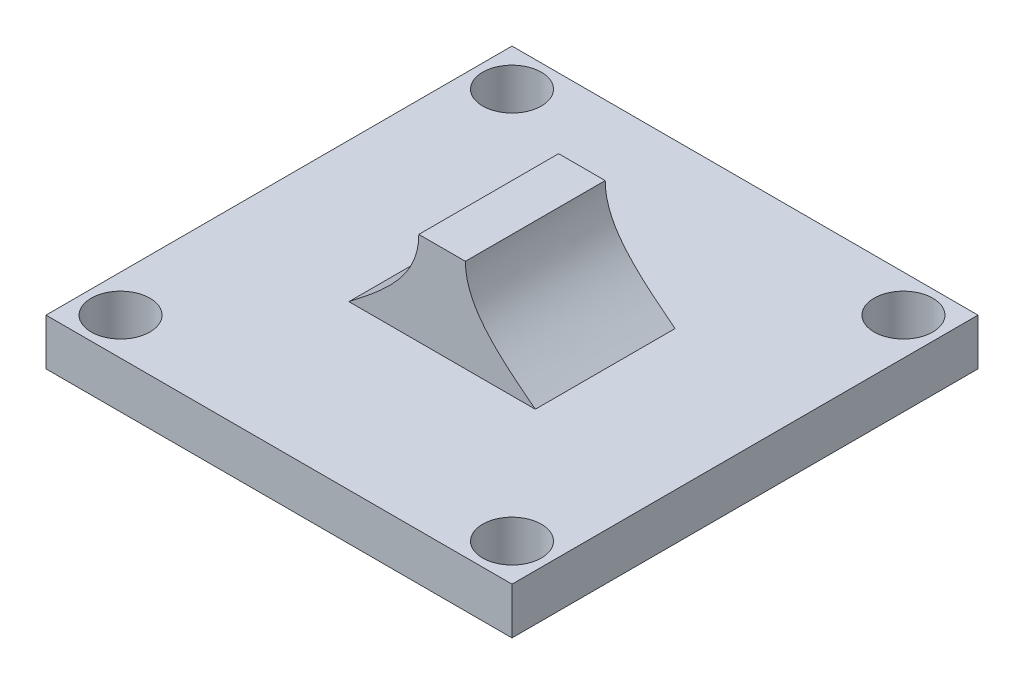
ISO-10303-21;
HEADER;
FILE_DESCRIPTION(('STEP AP214'),'2;1');
FILE_NAME('part.step','',(''),(''),'','','');
FILE_SCHEMA(('AUTOMOTIVE_DESIGN { 1 0 10303 214 1 1 1 1 }'));
ENDSEC;
DATA;
#1=APPLICATION_CONTEXT('core data for automotive mechanical design processes');
#2=APPLICATION_PROTOCOL_DEFINITION('international standard','automotive_design',2000,#1);
#3=PRODUCT_CONTEXT('',#1,'mechanical');
#4=PRODUCT('Part','Part','',(#3));
#5=PRODUCT_RELATED_PRODUCT_CATEGORY('part','',(#4));
#6=PRODUCT_DEFINITION_FORMATION('','',#4);
#7=PRODUCT_DEFINITION_CONTEXT('part definition',#1,'design');
#8=PRODUCT_DEFINITION('design','',#6,#7);
#9=PRODUCT_DEFINITION_SHAPE('','',#8);
#10=(LENGTH_UNIT() NAMED_UNIT(*) SI_UNIT(.MILLI.,.METRE.));
#11=(NAMED_UNIT(*) PLANE_ANGLE_UNIT() SI_UNIT($,.RADIAN.));
#12=(NAMED_UNIT(*) SI_UNIT($,.STERADIAN.) SOLID_ANGLE_UNIT());
#13=UNCERTAINTY_MEASURE_WITH_UNIT(LENGTH_MEASURE(1.E-05),#10,'distance_accuracy_value','');
#14=(GEOMETRIC_REPRESENTATION_CONTEXT(3) GLOBAL_UNCERTAINTY_ASSIGNED_CONTEXT((#13)) GLOBAL_UNIT_ASSIGNED_CONTEXT((#10,
#11,#12)) REPRESENTATION_CONTEXT('',''));
#15=CARTESIAN_POINT('',(0.,0.,0.));
#16=DIRECTION('',(0.,0.,1.));
#17=DIRECTION('',(1.,0.,0.));
#18=AXIS2_PLACEMENT_3D('',#15,#16,#17);
#19=CARTESIAN_POINT('',(0.,5.,0.));
#20=DIRECTION('',(0.,1.,0.));
#21=DIRECTION('',(0.,0.,1.));
#22=AXIS2_PLACEMENT_3D('',#19,#20,#21);
#23=PLANE('',#22);
#24=CARTESIAN_POINT('',(-21.,5.,-21.));
#25=DIRECTION('',(0.,1.,0.));
#26=DIRECTION('',(0.,0.,1.));
#27=AXIS2_PLACEMENT_3D('',#24,#25,#26);
#28=CIRCLE('',#27,3.15);
#29=CARTESIAN_POINT('',(-21.,5.,-24.15));
#30=VERTEX_POINT('',#29);
#31=EDGE_CURVE('E377',#30,#30,#28,.T.);
#32=ORIENTED_EDGE('',*,*,#31,.F.);
#33=EDGE_LOOP('',(#32));
#34=FACE_BOUND('',#33,.T.);
#35=CARTESIAN_POINT('',(21.,5.,-21.));
#36=DIRECTION('',(0.,1.,0.));
#37=DIRECTION('',(0.,0.,1.));
#38=AXIS2_PLACEMENT_3D('',#35,#36,#37);
#39=CIRCLE('',#38,3.15);
#40=CARTESIAN_POINT('',(21.,5.,-24.15));
#41=VERTEX_POINT('',#40);
#42=EDGE_CURVE('E380',#41,#41,#39,.T.);
#43=ORIENTED_EDGE('',*,*,#42,.F.);
#44=EDGE_LOOP('',(#43));
#45=FACE_BOUND('',#44,.T.);
#46=CARTESIAN_POINT('',(21.,5.,21.));
#47=DIRECTION('',(0.,1.,0.));
#48=DIRECTION('',(0.,0.,1.));
#49=AXIS2_PLACEMENT_3D('',#46,#47,#48);
#50=CIRCLE('',#49,3.15);
#51=CARTESIAN_POINT('',(21.,5.,17.85));
#52=VERTEX_POINT('',#51);
#53=EDGE_CURVE('E388',#52,#52,#50,.T.);
#54=ORIENTED_EDGE('',*,*,#53,.F.);
#55=EDGE_LOOP('',(#54));
#56=FACE_BOUND('',#55,.T.);
#57=CARTESIAN_POINT('',(-21.,5.,21.));
#58=DIRECTION('',(0.,1.,0.));
#59=DIRECTION('',(0.,0.,1.));
#60=AXIS2_PLACEMENT_3D('',#57,#58,#59);
#61=CIRCLE('',#60,3.15);
#62=CARTESIAN_POINT('',(-21.,5.,17.85));
#63=VERTEX_POINT('',#62);
#64=EDGE_CURVE('E510',#63,#63,#61,.T.);
#65=ORIENTED_EDGE('',*,*,#64,.F.);
#66=EDGE_LOOP('',(#65));
#67=FACE_BOUND('',#66,.T.);
#68=DIRECTION('',(0.,0.,-1.));
#69=VECTOR('',#68,1.);
#70=CARTESIAN_POINT('',(25.,5.,-25.));
#71=LINE('',#70,#69);
#72=CARTESIAN_POINT('',(25.,5.,25.));
#73=VERTEX_POINT('',#72);
#74=CARTESIAN_POINT('',(25.,5.,-25.));
#75=VERTEX_POINT('',#74);
#76=EDGE_CURVE('E270',#73,#75,#71,.T.);
#77=ORIENTED_EDGE('',*,*,#76,.T.);
#78=DIRECTION('',(-1.,0.,0.));
#79=VECTOR('',#78,1.);
#80=CARTESIAN_POINT('',(-25.,5.,-25.));
#81=LINE('',#80,#79);
#82=CARTESIAN_POINT('',(-25.,5.,-25.));
#83=VERTEX_POINT('',#82);
#84=EDGE_CURVE('E125',#75,#83,#81,.T.);
#85=ORIENTED_EDGE('',*,*,#84,.T.);
#86=DIRECTION('',(0.,0.,1.));
#87=VECTOR('',#86,1.);
#88=CARTESIAN_POINT('',(-25.,5.,-25.));
#89=LINE('',#88,#87);
#90=CARTESIAN_POINT('',(-25.,5.,25.));
#91=VERTEX_POINT('',#90);
#92=EDGE_CURVE('E263',#83,#91,#89,.T.);
#93=ORIENTED_EDGE('',*,*,#92,.T.);
#94=DIRECTION('',(1.,0.,0.));
#95=VECTOR('',#94,1.);
#96=CARTESIAN_POINT('',(-25.,5.,25.));
#97=LINE('',#96,#95);
#98=EDGE_CURVE('E97',#91,#73,#97,.T.);
#99=ORIENTED_EDGE('',*,*,#98,.T.);
#100=EDGE_LOOP('',(#77,#85,#93,#99));
#101=FACE_BOUND('',#100,.T.);
#102=DIRECTION('',(-1.,0.,0.));
#103=VECTOR('',#102,1.);
#104=CARTESIAN_POINT('',(-10.,5.,-7.5));
#105=LINE('',#104,#103);
#106=CARTESIAN_POINT('',(9.99999999999999,5.,-7.5));
#107=VERTEX_POINT('',#106);
#108=CARTESIAN_POINT('',(-10.,5.,-7.5));
#109=VERTEX_POINT('',#108);
#110=EDGE_CURVE('E279',#107,#109,#105,.T.);
#111=ORIENTED_EDGE('',*,*,#110,.F.);
#112=DIRECTION('',(0.,0.,-1.));
#113=VECTOR('',#112,1.);
#114=CARTESIAN_POINT('',(9.99999999999999,5.,-7.5));
#115=LINE('',#114,#113);
#116=CARTESIAN_POINT('',(9.99999999999999,5.,7.5));
#117=VERTEX_POINT('',#116);
#118=EDGE_CURVE('E183',#117,#107,#115,.T.);
#119=ORIENTED_EDGE('',*,*,#118,.F.);
#120=DIRECTION('',(1.,0.,0.));
#121=VECTOR('',#120,1.);
#122=CARTESIAN_POINT('',(-10.,5.,7.5));
#123=LINE('',#122,#121);
#124=CARTESIAN_POINT('',(-10.,5.,7.5));
#125=VERTEX_POINT('',#124);
#126=EDGE_CURVE('E187',#125,#117,#123,.T.);
#127=ORIENTED_EDGE('',*,*,#126,.F.);
#128=DIRECTION('',(0.,0.,1.));
#129=VECTOR('',#128,1.);
#130=CARTESIAN_POINT('',(-10.,5.,-7.5));
#131=LINE('',#130,#129);
#132=EDGE_CURVE('E181',#109,#125,#131,.T.);
#133=ORIENTED_EDGE('',*,*,#132,.F.);
#134=EDGE_LOOP('',(#111,#119,#127,#133));
#135=FACE_BOUND('',#134,.T.);
#136=ADVANCED_FACE('F70',(#34,#45,#56,#67,#101,#135),#23,.T.);
#137=CARTESIAN_POINT('',(25.,5.,-25.));
#138=DIRECTION('',(-1.,0.,0.));
#139=DIRECTION('',(0.,0.,1.));
#140=AXIS2_PLACEMENT_3D('',#137,#138,#139);
#141=PLANE('',#140);
#142=DIRECTION('',(0.,0.,-1.));
#143=VECTOR('',#142,1.);
#144=CARTESIAN_POINT('',(25.,0.,-25.));
#145=LINE('',#144,#143);
#146=CARTESIAN_POINT('',(25.,0.,25.));
#147=VERTEX_POINT('',#146);
#148=CARTESIAN_POINT('',(25.,0.,-25.));
#149=VERTEX_POINT('',#148);
#150=EDGE_CURVE('E260',#147,#149,#145,.T.);
#151=ORIENTED_EDGE('',*,*,#150,.T.);
#152=DIRECTION('',(0.,-1.,0.));
#153=VECTOR('',#152,1.);
#154=CARTESIAN_POINT('',(25.,5.,-25.));
#155=LINE('',#154,#153);
#156=EDGE_CURVE('E12',#75,#149,#155,.T.);
#157=ORIENTED_EDGE('',*,*,#156,.F.);
#158=ORIENTED_EDGE('',*,*,#76,.F.);
#159=DIRECTION('',(0.,-1.,0.));
#160=VECTOR('',#159,1.);
#161=CARTESIAN_POINT('',(25.,5.,25.));
#162=LINE('',#161,#160);
#163=EDGE_CURVE('E274',#73,#147,#162,.T.);
#164=ORIENTED_EDGE('',*,*,#163,.T.);
#165=EDGE_LOOP('',(#151,#157,#158,#164));
#166=FACE_BOUND('',#165,.T.);
#167=ADVANCED_FACE('F72',(#166),#141,.F.);
#168=CARTESIAN_POINT('',(-25.,5.,-25.));
#169=DIRECTION('',(0.,0.,1.));
#170=DIRECTION('',(1.,0.,0.));
#171=AXIS2_PLACEMENT_3D('',#168,#169,#170);
#172=PLANE('',#171);
#173=DIRECTION('',(-1.,0.,0.));
#174=VECTOR('',#173,1.);
#175=CARTESIAN_POINT('',(-25.,0.,-25.));
#176=LINE('',#175,#174);
#177=CARTESIAN_POINT('',(-25.,0.,-25.));
#178=VERTEX_POINT('',#177);
#179=EDGE_CURVE('E250',#149,#178,#176,.T.);
#180=ORIENTED_EDGE('',*,*,#179,.T.);
#181=DIRECTION('',(0.,-1.,0.));
#182=VECTOR('',#181,1.);
#183=CARTESIAN_POINT('',(-25.,5.,-25.));
#184=LINE('',#183,#182);
#185=EDGE_CURVE('E80',#83,#178,#184,.T.);
#186=ORIENTED_EDGE('',*,*,#185,.F.);
#187=ORIENTED_EDGE('',*,*,#84,.F.);
#188=ORIENTED_EDGE('',*,*,#156,.T.);
#189=EDGE_LOOP('',(#180,#186,#187,#188));
#190=FACE_BOUND('',#189,.T.);
#191=ADVANCED_FACE('F243',(#190),#172,.F.);
#192=CARTESIAN_POINT('',(-25.,5.,-25.));
#193=DIRECTION('',(1.,0.,0.));
#194=DIRECTION('',(0.,0.,-1.));
#195=AXIS2_PLACEMENT_3D('',#192,#193,#194);
#196=PLANE('',#195);
#197=DIRECTION('',(0.,0.,1.));
#198=VECTOR('',#197,1.);
#199=CARTESIAN_POINT('',(-25.,0.,-25.));
#200=LINE('',#199,#198);
#201=CARTESIAN_POINT('',(-25.,0.,25.));
#202=VERTEX_POINT('',#201);
#203=EDGE_CURVE('E259',#178,#202,#200,.T.);
#204=ORIENTED_EDGE('',*,*,#203,.T.);
#205=DIRECTION('',(0.,-1.,0.));
#206=VECTOR('',#205,1.);
#207=CARTESIAN_POINT('',(-25.,5.,25.));
#208=LINE('',#207,#206);
#209=EDGE_CURVE('E265',#91,#202,#208,.T.);
#210=ORIENTED_EDGE('',*,*,#209,.F.);
#211=ORIENTED_EDGE('',*,*,#92,.F.);
#212=ORIENTED_EDGE('',*,*,#185,.T.);
#213=EDGE_LOOP('',(#204,#210,#211,#212));
#214=FACE_BOUND('',#213,.T.);
#215=ADVANCED_FACE('F241',(#214),#196,.F.);
#216=CARTESIAN_POINT('',(-25.,5.,25.));
#217=DIRECTION('',(0.,0.,-1.));
#218=DIRECTION('',(-1.,0.,0.));
#219=AXIS2_PLACEMENT_3D('',#216,#217,#218);
#220=PLANE('',#219);
#221=DIRECTION('',(1.,0.,0.));
#222=VECTOR('',#221,1.);
#223=CARTESIAN_POINT('',(-25.,0.,25.));
#224=LINE('',#223,#222);
#225=EDGE_CURVE('E118',#202,#147,#224,.T.);
#226=ORIENTED_EDGE('',*,*,#225,.T.);
#227=ORIENTED_EDGE('',*,*,#163,.F.);
#228=ORIENTED_EDGE('',*,*,#98,.F.);
#229=ORIENTED_EDGE('',*,*,#209,.T.);
#230=EDGE_LOOP('',(#226,#227,#228,#229));
#231=FACE_BOUND('',#230,.T.);
#232=ADVANCED_FACE('F237',(#231),#220,.F.);
#233=CARTESIAN_POINT('',(0.,0.,0.));
#234=DIRECTION('',(0.,1.,0.));
#235=DIRECTION('',(0.,0.,1.));
#236=AXIS2_PLACEMENT_3D('',#233,#234,#235);
#237=PLANE('',#236);
#238=CARTESIAN_POINT('',(-21.,0.,-21.));
#239=DIRECTION('',(0.,-1.,0.));
#240=DIRECTION('',(0.,0.,-1.));
#241=AXIS2_PLACEMENT_3D('',#238,#239,#240);
#242=CIRCLE('',#241,3.15);
#243=CARTESIAN_POINT('',(-21.,0.,-24.15));
#244=VERTEX_POINT('',#243);
#245=EDGE_CURVE('E496',#244,#244,#242,.T.);
#246=ORIENTED_EDGE('',*,*,#245,.F.);
#247=EDGE_LOOP('',(#246));
#248=FACE_BOUND('',#247,.T.);
#249=CARTESIAN_POINT('',(21.,0.,-21.));
#250=DIRECTION('',(0.,-1.,0.));
#251=DIRECTION('',(0.,0.,-1.));
#252=AXIS2_PLACEMENT_3D('',#249,#250,#251);
#253=CIRCLE('',#252,3.15);
#254=CARTESIAN_POINT('',(21.,0.,-24.15));
#255=VERTEX_POINT('',#254);
#256=EDGE_CURVE('E498',#255,#255,#253,.T.);
#257=ORIENTED_EDGE('',*,*,#256,.F.);
#258=EDGE_LOOP('',(#257));
#259=FACE_BOUND('',#258,.T.);
#260=CARTESIAN_POINT('',(21.,0.,21.));
#261=DIRECTION('',(0.,-1.,0.));
#262=DIRECTION('',(0.,0.,-1.));
#263=AXIS2_PLACEMENT_3D('',#260,#261,#262);
#264=CIRCLE('',#263,3.15);
#265=CARTESIAN_POINT('',(21.,0.,17.85));
#266=VERTEX_POINT('',#265);
#267=EDGE_CURVE('E502',#266,#266,#264,.T.);
#268=ORIENTED_EDGE('',*,*,#267,.F.);
#269=EDGE_LOOP('',(#268));
#270=FACE_BOUND('',#269,.T.);
#271=CARTESIAN_POINT('',(-21.,0.,21.));
#272=DIRECTION('',(0.,-1.,0.));
#273=DIRECTION('',(0.,0.,-1.));
#274=AXIS2_PLACEMENT_3D('',#271,#272,#273);
#275=CIRCLE('',#274,3.15);
#276=CARTESIAN_POINT('',(-21.,0.,17.85));
#277=VERTEX_POINT('',#276);
#278=EDGE_CURVE('E506',#277,#277,#275,.T.);
#279=ORIENTED_EDGE('',*,*,#278,.F.);
#280=EDGE_LOOP('',(#279));
#281=FACE_BOUND('',#280,.T.);
#282=ORIENTED_EDGE('',*,*,#150,.F.);
#283=ORIENTED_EDGE('',*,*,#225,.F.);
#284=ORIENTED_EDGE('',*,*,#203,.F.);
#285=ORIENTED_EDGE('',*,*,#179,.F.);
#286=EDGE_LOOP('',(#282,#283,#284,#285));
#287=FACE_BOUND('',#286,.T.);
#288=ADVANCED_FACE('F234',(#248,#259,#270,#281,#287),#237,.F.);
#289=CARTESIAN_POINT('',(0.,15.,0.));
#290=DIRECTION('',(0.,1.,0.));
#291=DIRECTION('',(0.,0.,1.));
#292=AXIS2_PLACEMENT_3D('',#289,#290,#291);
#293=PLANE('',#292);
#294=DIRECTION('',(0.,0.,-1.));
#295=VECTOR('',#294,1.);
#296=CARTESIAN_POINT('',(2.5,15.,-7.5));
#297=LINE('',#296,#295);
#298=CARTESIAN_POINT('',(2.5,15.,7.5));
#299=VERTEX_POINT('',#298);
#300=CARTESIAN_POINT('',(2.5,15.,-7.5));
#301=VERTEX_POINT('',#300);
#302=EDGE_CURVE('E175',#299,#301,#297,.T.);
#303=ORIENTED_EDGE('',*,*,#302,.T.);
#304=DIRECTION('',(-1.,0.,0.));
#305=VECTOR('',#304,1.);
#306=CARTESIAN_POINT('',(-2.5,15.,-7.5));
#307=LINE('',#306,#305);
#308=CARTESIAN_POINT('',(-2.5,15.,-7.5));
#309=VERTEX_POINT('',#308);
#310=EDGE_CURVE('E155',#301,#309,#307,.T.);
#311=ORIENTED_EDGE('',*,*,#310,.T.);
#312=DIRECTION('',(0.,0.,1.));
#313=VECTOR('',#312,1.);
#314=CARTESIAN_POINT('',(-2.5,15.,-7.5));
#315=LINE('',#314,#313);
#316=CARTESIAN_POINT('',(-2.5,15.,7.5));
#317=VERTEX_POINT('',#316);
#318=EDGE_CURVE('E147',#309,#317,#315,.T.);
#319=ORIENTED_EDGE('',*,*,#318,.T.);
#320=DIRECTION('',(1.,0.,0.));
#321=VECTOR('',#320,1.);
#322=CARTESIAN_POINT('',(-2.5,15.,7.5));
#323=LINE('',#322,#321);
#324=EDGE_CURVE('E152',#317,#299,#323,.T.);
#325=ORIENTED_EDGE('',*,*,#324,.T.);
#326=EDGE_LOOP('',(#303,#311,#319,#325));
#327=FACE_BOUND('',#326,.T.);
#328=ADVANCED_FACE('F151',(#327),#293,.T.);
#329=CARTESIAN_POINT('',(-2.5,15.,-7.5));
#330=DIRECTION('',(0.,0.,-1.));
#331=DIRECTION('',(1.,0.,0.));
#332=AXIS2_PLACEMENT_3D('',#329,#330,#331);
#333=PLANE('',#332);
#334=ORIENTED_EDGE('',*,*,#310,.F.);
#335=CARTESIAN_POINT('',(2.5,15.,-7.5));
#336=CARTESIAN_POINT('',(2.5,10.8333333333333,-7.5));
#337=CARTESIAN_POINT('',(6.25,7.91666666666667,-7.5));
#338=CARTESIAN_POINT('',(9.99999999999999,5.,-7.5));
#339=B_SPLINE_CURVE_WITH_KNOTS('',3,(#335,#336,#337,#338),.UNSPECIFIED.,.F.,.F.,(4,4),(0.,1.),.UNSPECIFIED.);
#340=EDGE_CURVE('E88',#301,#107,#339,.T.);
#341=ORIENTED_EDGE('',*,*,#340,.T.);
#342=ORIENTED_EDGE('',*,*,#110,.T.);
#343=CARTESIAN_POINT('',(-2.5,15.,-7.5));
#344=CARTESIAN_POINT('',(-2.5,10.8333333333333,-7.5));
#345=CARTESIAN_POINT('',(-6.25,7.91666666666667,-7.5));
#346=CARTESIAN_POINT('',(-10.,5.,-7.5));
#347=B_SPLINE_CURVE_WITH_KNOTS('',3,(#343,#344,#345,#346),.UNSPECIFIED.,.F.,.F.,(4,4),(0.,1.),.UNSPECIFIED.);
#348=EDGE_CURVE('E336',#109,#309,#347,.F.);
#349=ORIENTED_EDGE('',*,*,#348,.T.);
#350=EDGE_LOOP('',(#334,#341,#342,#349));
#351=FACE_BOUND('',#350,.T.);
#352=ADVANCED_FACE('F312',(#351),#333,.T.);
#353=CARTESIAN_POINT('',(2.5,15.,-7.5));
#354=CARTESIAN_POINT('',(2.5,10.8333333333333,-7.5));
#355=CARTESIAN_POINT('',(6.25,7.91666666666667,-7.5));
#356=CARTESIAN_POINT('',(9.99999999999999,5.,-7.5));
#357=CARTESIAN_POINT('',(2.5,15.,-2.5));
#358=CARTESIAN_POINT('',(2.5,10.8333333333333,-2.5));
#359=CARTESIAN_POINT('',(6.25,7.91666666666667,-2.5));
#360=CARTESIAN_POINT('',(9.99999999999999,5.,-2.5));
#361=CARTESIAN_POINT('',(2.5,15.,2.5));
#362=CARTESIAN_POINT('',(2.5,10.8333333333333,2.5));
#363=CARTESIAN_POINT('',(6.25,7.91666666666667,2.5));
#364=CARTESIAN_POINT('',(9.99999999999999,5.,2.5));
#365=CARTESIAN_POINT('',(2.5,15.,7.5));
#366=CARTESIAN_POINT('',(2.5,10.8333333333333,7.5));
#367=CARTESIAN_POINT('',(6.25,7.91666666666667,7.5));
#368=CARTESIAN_POINT('',(9.99999999999999,5.,7.5));
#369=B_SPLINE_SURFACE_WITH_KNOTS('',3,3,((#353,#354,#355,#356),(#357,#358,#359,#360),(#361,#362,
#363,#364),(#365,#366,#367,#368)),.UNSPECIFIED.,.F.,.F.,.F.,(4,4),(4,4),(0.,1.),(0.,1.),.UNSPECIFIED.);
#370=CARTESIAN_POINT('',(2.5,15.,7.5));
#371=CARTESIAN_POINT('',(2.5,10.8333333333333,7.5));
#372=CARTESIAN_POINT('',(6.25,7.91666666666667,7.5));
#373=CARTESIAN_POINT('',(9.99999999999999,5.,7.5));
#374=B_SPLINE_CURVE_WITH_KNOTS('',3,(#370,#371,#372,#373),.UNSPECIFIED.,.F.,.F.,(4,4),(0.,1.),.UNSPECIFIED.);
#375=EDGE_CURVE('E173',#299,#117,#374,.T.);
#376=ORIENTED_EDGE('',*,*,#302,.F.);
#377=ORIENTED_EDGE('',*,*,#375,.T.);
#378=ORIENTED_EDGE('',*,*,#118,.T.);
#379=ORIENTED_EDGE('',*,*,#340,.F.);
#380=EDGE_LOOP('',(#376,#377,#378,#379));
#381=FACE_BOUND('',#380,.T.);
#382=ADVANCED_FACE('F217',(#381),#369,.T.);
#383=CARTESIAN_POINT('',(-2.5,15.,7.5));
#384=CARTESIAN_POINT('',(-2.5,10.8333333333333,7.5));
#385=CARTESIAN_POINT('',(-6.25,7.91666666666667,7.5));
#386=CARTESIAN_POINT('',(-10.,5.,7.5));
#387=CARTESIAN_POINT('',(-2.5,15.,2.5));
#388=CARTESIAN_POINT('',(-2.5,10.8333333333333,2.5));
#389=CARTESIAN_POINT('',(-6.25,7.91666666666667,2.5));
#390=CARTESIAN_POINT('',(-10.,5.,2.5));
#391=CARTESIAN_POINT('',(-2.5,15.,-2.5));
#392=CARTESIAN_POINT('',(-2.5,10.8333333333333,-2.5));
#393=CARTESIAN_POINT('',(-6.25,7.91666666666667,-2.5));
#394=CARTESIAN_POINT('',(-10.,5.,-2.5));
#395=CARTESIAN_POINT('',(-2.5,15.,-7.5));
#396=CARTESIAN_POINT('',(-2.5,10.8333333333333,-7.5));
#397=CARTESIAN_POINT('',(-6.25,7.91666666666667,-7.5));
#398=CARTESIAN_POINT('',(-10.,5.,-7.5));
#399=B_SPLINE_SURFACE_WITH_KNOTS('',3,3,((#383,#384,#385,#386),(#387,#388,#389,#390),(#391,#392,
#393,#394),(#395,#396,#397,#398)),.UNSPECIFIED.,.F.,.F.,.F.,(4,4),(4,4),(0.,1.),(0.,1.),.UNSPECIFIED.);
#400=CARTESIAN_POINT('',(-2.5,15.,7.5));
#401=CARTESIAN_POINT('',(-2.5,10.8333333333333,7.5));
#402=CARTESIAN_POINT('',(-6.25,7.91666666666667,7.5));
#403=CARTESIAN_POINT('',(-10.,5.,7.5));
#404=B_SPLINE_CURVE_WITH_KNOTS('',3,(#400,#401,#402,#403),.UNSPECIFIED.,.F.,.F.,(4,4),(0.,1.),.UNSPECIFIED.);
#405=EDGE_CURVE('E170',#317,#125,#404,.T.);
#406=ORIENTED_EDGE('',*,*,#318,.F.);
#407=ORIENTED_EDGE('',*,*,#348,.F.);
#408=ORIENTED_EDGE('',*,*,#132,.T.);
#409=ORIENTED_EDGE('',*,*,#405,.F.);
#410=EDGE_LOOP('',(#406,#407,#408,#409));
#411=FACE_BOUND('',#410,.T.);
#412=ADVANCED_FACE('F179',(#411),#399,.T.);
#413=CARTESIAN_POINT('',(2.5,15.,7.5));
#414=DIRECTION('',(0.,0.,1.));
#415=DIRECTION('',(-1.,0.,0.));
#416=AXIS2_PLACEMENT_3D('',#413,#414,#415);
#417=PLANE('',#416);
#418=ORIENTED_EDGE('',*,*,#324,.F.);
#419=ORIENTED_EDGE('',*,*,#405,.T.);
#420=ORIENTED_EDGE('',*,*,#126,.T.);
#421=ORIENTED_EDGE('',*,*,#375,.F.);
#422=EDGE_LOOP('',(#418,#419,#420,#421));
#423=FACE_BOUND('',#422,.T.);
#424=ADVANCED_FACE('F169',(#423),#417,.T.);
#425=CARTESIAN_POINT('',(-21.,15.0001,21.));
#426=DIRECTION('',(0.,-1.,0.));
#427=DIRECTION('',(0.,0.,-1.));
#428=AXIS2_PLACEMENT_3D('',#425,#426,#427);
#429=CYLINDRICAL_SURFACE('',#428,3.15);
#430=CARTESIAN_POINT('',(-21.,5.,17.85));
#431=CARTESIAN_POINT('',(-21.,4.94791666666667,17.85));
#432=CARTESIAN_POINT('',(-21.,4.89583333333333,17.85));
#433=CARTESIAN_POINT('',(-21.,4.79166666666667,17.85));
#434=CARTESIAN_POINT('',(-21.,4.73958333333333,17.85));
#435=CARTESIAN_POINT('',(-21.,4.63541666666667,17.85));
#436=CARTESIAN_POINT('',(-21.,4.58333333333333,17.85));
#437=CARTESIAN_POINT('',(-21.,4.47916666666667,17.85));
#438=CARTESIAN_POINT('',(-21.,4.42708333333333,17.85));
#439=CARTESIAN_POINT('',(-21.,4.32291666666667,17.85));
#440=CARTESIAN_POINT('',(-21.,4.27083333333333,17.85));
#441=CARTESIAN_POINT('',(-21.,4.16666666666667,17.85));
#442=CARTESIAN_POINT('',(-21.,4.11458333333333,17.85));
#443=CARTESIAN_POINT('',(-21.,4.01041666666667,17.85));
#444=CARTESIAN_POINT('',(-21.,3.95833333333333,17.85));
#445=CARTESIAN_POINT('',(-21.,3.85416666666667,17.85));
#446=CARTESIAN_POINT('',(-21.,3.80208333333333,17.85));
#447=CARTESIAN_POINT('',(-21.,3.69791666666667,17.85));
#448=CARTESIAN_POINT('',(-21.,3.64583333333333,17.85));
#449=CARTESIAN_POINT('',(-21.,3.54166666666667,17.85));
#450=CARTESIAN_POINT('',(-21.,3.48958333333333,17.85));
#451=CARTESIAN_POINT('',(-21.,3.38541666666667,17.85));
#452=CARTESIAN_POINT('',(-21.,3.33333333333333,17.85));
#453=CARTESIAN_POINT('',(-21.,3.22916666666667,17.85));
#454=CARTESIAN_POINT('',(-21.,3.17708333333333,17.85));
#455=CARTESIAN_POINT('',(-21.,3.07291666666667,17.85));
#456=CARTESIAN_POINT('',(-21.,3.02083333333333,17.85));
#457=CARTESIAN_POINT('',(-21.,2.91666666666667,17.85));
#458=CARTESIAN_POINT('',(-21.,2.86458333333333,17.85));
#459=CARTESIAN_POINT('',(-21.,2.76041666666667,17.85));
#460=CARTESIAN_POINT('',(-21.,2.70833333333333,17.85));
#461=CARTESIAN_POINT('',(-21.,2.60416666666667,17.85));
#462=CARTESIAN_POINT('',(-21.,2.55208333333333,17.85));
#463=CARTESIAN_POINT('',(-21.,2.44791666666667,17.85));
#464=CARTESIAN_POINT('',(-21.,2.39583333333333,17.85));
#465=CARTESIAN_POINT('',(-21.,2.29166666666667,17.85));
#466=CARTESIAN_POINT('',(-21.,2.23958333333333,17.85));
#467=CARTESIAN_POINT('',(-21.,2.13541666666667,17.85));
#468=CARTESIAN_POINT('',(-21.,2.08333333333333,17.85));
#469=CARTESIAN_POINT('',(-21.,1.97916666666667,17.85));
#470=CARTESIAN_POINT('',(-21.,1.92708333333333,17.85));
#471=CARTESIAN_POINT('',(-21.,1.82291666666667,17.85));
#472=CARTESIAN_POINT('',(-21.,1.77083333333333,17.85));
#473=CARTESIAN_POINT('',(-21.,1.66666666666667,17.85));
#474=CARTESIAN_POINT('',(-21.,1.61458333333333,17.85));
#475=CARTESIAN_POINT('',(-21.,1.51041666666667,17.85));
#476=CARTESIAN_POINT('',(-21.,1.45833333333333,17.85));
#477=CARTESIAN_POINT('',(-21.,1.35416666666667,17.85));
#478=CARTESIAN_POINT('',(-21.,1.30208333333333,17.85));
#479=CARTESIAN_POINT('',(-21.,1.19791666666667,17.85));
#480=CARTESIAN_POINT('',(-21.,1.14583333333333,17.85));
#481=CARTESIAN_POINT('',(-21.,1.04166666666667,17.85));
#482=CARTESIAN_POINT('',(-21.,0.989583333333334,17.85));
#483=CARTESIAN_POINT('',(-21.,0.885416666666668,17.85));
#484=CARTESIAN_POINT('',(-21.,0.833333333333335,17.85));
#485=CARTESIAN_POINT('',(-21.,0.729166666666669,17.85));
#486=CARTESIAN_POINT('',(-21.,0.677083333333336,17.85));
#487=CARTESIAN_POINT('',(-21.,0.572916666666669,17.85));
#488=CARTESIAN_POINT('',(-21.,0.520833333333335,17.85));
#489=CARTESIAN_POINT('',(-21.,0.416666666666669,17.85));
#490=CARTESIAN_POINT('',(-21.,0.364583333333335,17.85));
#491=CARTESIAN_POINT('',(-21.,0.260416666666669,17.85));
#492=CARTESIAN_POINT('',(-21.,0.208333333333335,17.85));
#493=CARTESIAN_POINT('',(-21.,0.104166666666669,17.85));
#494=CARTESIAN_POINT('',(-21.,0.0520833333333352,17.85));
#495=CARTESIAN_POINT('',(-21.,0.,17.85));
#496=B_SPLINE_CURVE_WITH_KNOTS('',3,(#430,#431,#432,#433,#434,#435,#436,#437,#438,#439,#440,
#441,#442,#443,#444,#445,#446,#447,#448,#449,#450,#451,#452,#453,#454,#455,#456,#457,#458,#459,
#460,#461,#462,#463,#464,#465,#466,#467,#468,#469,#470,#471,#472,#473,#474,#475,#476,#477,#478,
#479,#480,#481,#482,#483,#484,#485,#486,#487,#488,#489,#490,#491,#492,#493,#494,#495),
.UNSPECIFIED.,.F.,.F.,(4,2,2,2,2,2,2,2,2,2,2,2,2,2,2,2,2,2,2,2,2,2,2,2,2,2,2,2,2,2,2,2,4),(0.,
0.15625,0.3125,0.46875,0.625000000000001,0.781249999999999,0.937499999999999,1.09375,1.25,
1.40625,1.5625,1.71875,1.875,2.03125,2.1875,2.34375,2.5,2.65625,2.8125,2.96875,3.125,3.28125,
3.4375,3.59375,3.75,3.90625,4.0625,4.21875,4.375,4.53125,4.6875,4.84375,5.),.UNSPECIFIED.);
#497=EDGE_CURVE('BSEAM230',#63,#277,#496,.T.);
#498=ORIENTED_EDGE('',*,*,#64,.T.);
#499=ORIENTED_EDGE('',*,*,#278,.T.);
#500=ORIENTED_EDGE('',*,*,#497,.T.);
#501=ORIENTED_EDGE('',*,*,#497,.F.);
#502=EDGE_LOOP('',(#498,#500,#499,#501));
#503=FACE_BOUND('',#502,.T.);
#504=ADVANCED_FACE('F230',(#503),#429,.F.);
#505=CARTESIAN_POINT('',(21.,15.0001,21.));
#506=DIRECTION('',(0.,-1.,0.));
#507=DIRECTION('',(0.,0.,-1.));
#508=AXIS2_PLACEMENT_3D('',#505,#506,#507);
#509=CYLINDRICAL_SURFACE('',#508,3.15);
#510=CARTESIAN_POINT('',(21.,5.,17.85));
#511=CARTESIAN_POINT('',(21.,4.94791666666667,17.85));
#512=CARTESIAN_POINT('',(21.,4.89583333333333,17.85));
#513=CARTESIAN_POINT('',(21.,4.79166666666667,17.85));
#514=CARTESIAN_POINT('',(21.,4.73958333333333,17.85));
#515=CARTESIAN_POINT('',(21.,4.63541666666667,17.85));
#516=CARTESIAN_POINT('',(21.,4.58333333333333,17.85));
#517=CARTESIAN_POINT('',(21.,4.47916666666667,17.85));
#518=CARTESIAN_POINT('',(21.,4.42708333333333,17.85));
#519=CARTESIAN_POINT('',(21.,4.32291666666667,17.85));
#520=CARTESIAN_POINT('',(21.,4.27083333333333,17.85));
#521=CARTESIAN_POINT('',(21.,4.16666666666667,17.85));
#522=CARTESIAN_POINT('',(21.,4.11458333333333,17.85));
#523=CARTESIAN_POINT('',(21.,4.01041666666667,17.85));
#524=CARTESIAN_POINT('',(21.,3.95833333333333,17.85));
#525=CARTESIAN_POINT('',(21.,3.85416666666667,17.85));
#526=CARTESIAN_POINT('',(21.,3.80208333333333,17.85));
#527=CARTESIAN_POINT('',(21.,3.69791666666667,17.85));
#528=CARTESIAN_POINT('',(21.,3.64583333333333,17.85));
#529=CARTESIAN_POINT('',(21.,3.54166666666667,17.85));
#530=CARTESIAN_POINT('',(21.,3.48958333333333,17.85));
#531=CARTESIAN_POINT('',(21.,3.38541666666667,17.85));
#532=CARTESIAN_POINT('',(21.,3.33333333333333,17.85));
#533=CARTESIAN_POINT('',(21.,3.22916666666667,17.85));
#534=CARTESIAN_POINT('',(21.,3.17708333333333,17.85));
#535=CARTESIAN_POINT('',(21.,3.07291666666667,17.85));
#536=CARTESIAN_POINT('',(21.,3.02083333333333,17.85));
#537=CARTESIAN_POINT('',(21.,2.91666666666667,17.85));
#538=CARTESIAN_POINT('',(21.,2.86458333333333,17.85));
#539=CARTESIAN_POINT('',(21.,2.76041666666667,17.85));
#540=CARTESIAN_POINT('',(21.,2.70833333333333,17.85));
#541=CARTESIAN_POINT('',(21.,2.60416666666667,17.85));
#542=CARTESIAN_POINT('',(21.,2.55208333333333,17.85));
#543=CARTESIAN_POINT('',(21.,2.44791666666667,17.85));
#544=CARTESIAN_POINT('',(21.,2.39583333333333,17.85));
#545=CARTESIAN_POINT('',(21.,2.29166666666667,17.85));
#546=CARTESIAN_POINT('',(21.,2.23958333333333,17.85));
#547=CARTESIAN_POINT('',(21.,2.13541666666667,17.85));
#548=CARTESIAN_POINT('',(21.,2.08333333333333,17.85));
#549=CARTESIAN_POINT('',(21.,1.97916666666667,17.85));
#550=CARTESIAN_POINT('',(21.,1.92708333333333,17.85));
#551=CARTESIAN_POINT('',(21.,1.82291666666667,17.85));
#552=CARTESIAN_POINT('',(21.,1.77083333333333,17.85));
#553=CARTESIAN_POINT('',(21.,1.66666666666667,17.85));
#554=CARTESIAN_POINT('',(21.,1.61458333333333,17.85));
#555=CARTESIAN_POINT('',(21.,1.51041666666667,17.85));
#556=CARTESIAN_POINT('',(21.,1.45833333333333,17.85));
#557=CARTESIAN_POINT('',(21.,1.35416666666667,17.85));
#558=CARTESIAN_POINT('',(21.,1.30208333333333,17.85));
#559=CARTESIAN_POINT('',(21.,1.19791666666667,17.85));
#560=CARTESIAN_POINT('',(21.,1.14583333333333,17.85));
#561=CARTESIAN_POINT('',(21.,1.04166666666667,17.85));
#562=CARTESIAN_POINT('',(21.,0.989583333333334,17.85));
#563=CARTESIAN_POINT('',(21.,0.885416666666668,17.85));
#564=CARTESIAN_POINT('',(21.,0.833333333333335,17.85));
#565=CARTESIAN_POINT('',(21.,0.729166666666669,17.85));
#566=CARTESIAN_POINT('',(21.,0.677083333333336,17.85));
#567=CARTESIAN_POINT('',(21.,0.572916666666669,17.85));
#568=CARTESIAN_POINT('',(21.,0.520833333333335,17.85));
#569=CARTESIAN_POINT('',(21.,0.416666666666669,17.85));
#570=CARTESIAN_POINT('',(21.,0.364583333333335,17.85));
#571=CARTESIAN_POINT('',(21.,0.260416666666669,17.85));
#572=CARTESIAN_POINT('',(21.,0.208333333333335,17.85));
#573=CARTESIAN_POINT('',(21.,0.104166666666669,17.85));
#574=CARTESIAN_POINT('',(21.,0.0520833333333352,17.85));
#575=CARTESIAN_POINT('',(21.,0.,17.85));
#576=B_SPLINE_CURVE_WITH_KNOTS('',3,(#510,#511,#512,#513,#514,#515,#516,#517,#518,#519,#520,
#521,#522,#523,#524,#525,#526,#527,#528,#529,#530,#531,#532,#533,#534,#535,#536,#537,#538,#539,
#540,#541,#542,#543,#544,#545,#546,#547,#548,#549,#550,#551,#552,#553,#554,#555,#556,#557,#558,
#559,#560,#561,#562,#563,#564,#565,#566,#567,#568,#569,#570,#571,#572,#573,#574,#575),
.UNSPECIFIED.,.F.,.F.,(4,2,2,2,2,2,2,2,2,2,2,2,2,2,2,2,2,2,2,2,2,2,2,2,2,2,2,2,2,2,2,2,4),(0.,
0.15625,0.3125,0.46875,0.625000000000001,0.781249999999999,0.937499999999999,1.09375,1.25,
1.40625,1.5625,1.71875,1.875,2.03125,2.1875,2.34375,2.5,2.65625,2.8125,2.96875,3.125,3.28125,
3.4375,3.59375,3.75,3.90625,4.0625,4.21875,4.375,4.53125,4.6875,4.84375,5.),.UNSPECIFIED.);
#577=EDGE_CURVE('BSEAM425',#52,#266,#576,.T.);
#578=ORIENTED_EDGE('',*,*,#53,.T.);
#579=ORIENTED_EDGE('',*,*,#267,.T.);
#580=ORIENTED_EDGE('',*,*,#577,.T.);
#581=ORIENTED_EDGE('',*,*,#577,.F.);
#582=EDGE_LOOP('',(#578,#580,#579,#581));
#583=FACE_BOUND('',#582,.T.);
#584=ADVANCED_FACE('F425',(#583),#509,.F.);
#585=CARTESIAN_POINT('',(21.,15.0001,-21.));
#586=DIRECTION('',(0.,-1.,0.));
#587=DIRECTION('',(0.,0.,-1.));
#588=AXIS2_PLACEMENT_3D('',#585,#586,#587);
#589=CYLINDRICAL_SURFACE('',#588,3.15);
#590=CARTESIAN_POINT('',(21.,5.,-24.15));
#591=CARTESIAN_POINT('',(21.,4.94791666666667,-24.15));
#592=CARTESIAN_POINT('',(21.,4.89583333333333,-24.15));
#593=CARTESIAN_POINT('',(21.,4.79166666666667,-24.15));
#594=CARTESIAN_POINT('',(21.,4.73958333333333,-24.15));
#595=CARTESIAN_POINT('',(21.,4.63541666666667,-24.15));
#596=CARTESIAN_POINT('',(21.,4.58333333333333,-24.15));
#597=CARTESIAN_POINT('',(21.,4.47916666666667,-24.15));
#598=CARTESIAN_POINT('',(21.,4.42708333333333,-24.15));
#599=CARTESIAN_POINT('',(21.,4.32291666666667,-24.15));
#600=CARTESIAN_POINT('',(21.,4.27083333333333,-24.15));
#601=CARTESIAN_POINT('',(21.,4.16666666666667,-24.15));
#602=CARTESIAN_POINT('',(21.,4.11458333333333,-24.15));
#603=CARTESIAN_POINT('',(21.,4.01041666666667,-24.15));
#604=CARTESIAN_POINT('',(21.,3.95833333333333,-24.15));
#605=CARTESIAN_POINT('',(21.,3.85416666666667,-24.15));
#606=CARTESIAN_POINT('',(21.,3.80208333333333,-24.15));
#607=CARTESIAN_POINT('',(21.,3.69791666666667,-24.15));
#608=CARTESIAN_POINT('',(21.,3.64583333333333,-24.15));
#609=CARTESIAN_POINT('',(21.,3.54166666666667,-24.15));
#610=CARTESIAN_POINT('',(21.,3.48958333333333,-24.15));
#611=CARTESIAN_POINT('',(21.,3.38541666666667,-24.15));
#612=CARTESIAN_POINT('',(21.,3.33333333333333,-24.15));
#613=CARTESIAN_POINT('',(21.,3.22916666666667,-24.15));
#614=CARTESIAN_POINT('',(21.,3.17708333333333,-24.15));
#615=CARTESIAN_POINT('',(21.,3.07291666666667,-24.15));
#616=CARTESIAN_POINT('',(21.,3.02083333333333,-24.15));
#617=CARTESIAN_POINT('',(21.,2.91666666666667,-24.15));
#618=CARTESIAN_POINT('',(21.,2.86458333333333,-24.15));
#619=CARTESIAN_POINT('',(21.,2.76041666666667,-24.15));
#620=CARTESIAN_POINT('',(21.,2.70833333333333,-24.15));
#621=CARTESIAN_POINT('',(21.,2.60416666666667,-24.15));
#622=CARTESIAN_POINT('',(21.,2.55208333333333,-24.15));
#623=CARTESIAN_POINT('',(21.,2.44791666666667,-24.15));
#624=CARTESIAN_POINT('',(21.,2.39583333333333,-24.15));
#625=CARTESIAN_POINT('',(21.,2.29166666666667,-24.15));
#626=CARTESIAN_POINT('',(21.,2.23958333333333,-24.15));
#627=CARTESIAN_POINT('',(21.,2.13541666666667,-24.15));
#628=CARTESIAN_POINT('',(21.,2.08333333333333,-24.15));
#629=CARTESIAN_POINT('',(21.,1.97916666666667,-24.15));
#630=CARTESIAN_POINT('',(21.,1.92708333333333,-24.15));
#631=CARTESIAN_POINT('',(21.,1.82291666666667,-24.15));
#632=CARTESIAN_POINT('',(21.,1.77083333333333,-24.15));
#633=CARTESIAN_POINT('',(21.,1.66666666666667,-24.15));
#634=CARTESIAN_POINT('',(21.,1.61458333333333,-24.15));
#635=CARTESIAN_POINT('',(21.,1.51041666666667,-24.15));
#636=CARTESIAN_POINT('',(21.,1.45833333333333,-24.15));
#637=CARTESIAN_POINT('',(21.,1.35416666666667,-24.15));
#638=CARTESIAN_POINT('',(21.,1.30208333333333,-24.15));
#639=CARTESIAN_POINT('',(21.,1.19791666666667,-24.15));
#640=CARTESIAN_POINT('',(21.,1.14583333333333,-24.15));
#641=CARTESIAN_POINT('',(21.,1.04166666666667,-24.15));
#642=CARTESIAN_POINT('',(21.,0.989583333333334,-24.15));
#643=CARTESIAN_POINT('',(21.,0.885416666666668,-24.15));
#644=CARTESIAN_POINT('',(21.,0.833333333333335,-24.15));
#645=CARTESIAN_POINT('',(21.,0.729166666666669,-24.15));
#646=CARTESIAN_POINT('',(21.,0.677083333333336,-24.15));
#647=CARTESIAN_POINT('',(21.,0.572916666666669,-24.15));
#648=CARTESIAN_POINT('',(21.,0.520833333333335,-24.15));
#649=CARTESIAN_POINT('',(21.,0.416666666666669,-24.15));
#650=CARTESIAN_POINT('',(21.,0.364583333333335,-24.15));
#651=CARTESIAN_POINT('',(21.,0.260416666666669,-24.15));
#652=CARTESIAN_POINT('',(21.,0.208333333333335,-24.15));
#653=CARTESIAN_POINT('',(21.,0.104166666666669,-24.15));
#654=CARTESIAN_POINT('',(21.,0.0520833333333352,-24.15));
#655=CARTESIAN_POINT('',(21.,0.,-24.15));
#656=B_SPLINE_CURVE_WITH_KNOTS('',3,(#590,#591,#592,#593,#594,#595,#596,#597,#598,#599,#600,
#601,#602,#603,#604,#605,#606,#607,#608,#609,#610,#611,#612,#613,#614,#615,#616,#617,#618,#619,
#620,#621,#622,#623,#624,#625,#626,#627,#628,#629,#630,#631,#632,#633,#634,#635,#636,#637,#638,
#639,#640,#641,#642,#643,#644,#645,#646,#647,#648,#649,#650,#651,#652,#653,#654,#655),
.UNSPECIFIED.,.F.,.F.,(4,2,2,2,2,2,2,2,2,2,2,2,2,2,2,2,2,2,2,2,2,2,2,2,2,2,2,2,2,2,2,2,4),(0.,
0.15625,0.3125,0.46875,0.625000000000001,0.781249999999999,0.937499999999999,1.09375,1.25,
1.40625,1.5625,1.71875,1.875,2.03125,2.1875,2.34375,2.5,2.65625,2.8125,2.96875,3.125,3.28125,
3.4375,3.59375,3.75,3.90625,4.0625,4.21875,4.375,4.53125,4.6875,4.84375,5.),.UNSPECIFIED.);
#657=EDGE_CURVE('BSEAM433',#41,#255,#656,.T.);
#658=ORIENTED_EDGE('',*,*,#42,.T.);
#659=ORIENTED_EDGE('',*,*,#256,.T.);
#660=ORIENTED_EDGE('',*,*,#657,.T.);
#661=ORIENTED_EDGE('',*,*,#657,.F.);
#662=EDGE_LOOP('',(#658,#660,#659,#661));
#663=FACE_BOUND('',#662,.T.);
#664=ADVANCED_FACE('F433',(#663),#589,.F.);
#665=CARTESIAN_POINT('',(-21.,15.0001,-21.));
#666=DIRECTION('',(0.,-1.,0.));
#667=DIRECTION('',(0.,0.,-1.));
#668=AXIS2_PLACEMENT_3D('',#665,#666,#667);
#669=CYLINDRICAL_SURFACE('',#668,3.15);
#670=CARTESIAN_POINT('',(-21.,5.,-24.15));
#671=CARTESIAN_POINT('',(-21.,4.94791666666667,-24.15));
#672=CARTESIAN_POINT('',(-21.,4.89583333333333,-24.15));
#673=CARTESIAN_POINT('',(-21.,4.79166666666667,-24.15));
#674=CARTESIAN_POINT('',(-21.,4.73958333333333,-24.15));
#675=CARTESIAN_POINT('',(-21.,4.63541666666667,-24.15));
#676=CARTESIAN_POINT('',(-21.,4.58333333333333,-24.15));
#677=CARTESIAN_POINT('',(-21.,4.47916666666667,-24.15));
#678=CARTESIAN_POINT('',(-21.,4.42708333333333,-24.15));
#679=CARTESIAN_POINT('',(-21.,4.32291666666667,-24.15));
#680=CARTESIAN_POINT('',(-21.,4.27083333333333,-24.15));
#681=CARTESIAN_POINT('',(-21.,4.16666666666667,-24.15));
#682=CARTESIAN_POINT('',(-21.,4.11458333333333,-24.15));
#683=CARTESIAN_POINT('',(-21.,4.01041666666667,-24.15));
#684=CARTESIAN_POINT('',(-21.,3.95833333333333,-24.15));
#685=CARTESIAN_POINT('',(-21.,3.85416666666667,-24.15));
#686=CARTESIAN_POINT('',(-21.,3.80208333333333,-24.15));
#687=CARTESIAN_POINT('',(-21.,3.69791666666667,-24.15));
#688=CARTESIAN_POINT('',(-21.,3.64583333333333,-24.15));
#689=CARTESIAN_POINT('',(-21.,3.54166666666667,-24.15));
#690=CARTESIAN_POINT('',(-21.,3.48958333333333,-24.15));
#691=CARTESIAN_POINT('',(-21.,3.38541666666667,-24.15));
#692=CARTESIAN_POINT('',(-21.,3.33333333333333,-24.15));
#693=CARTESIAN_POINT('',(-21.,3.22916666666667,-24.15));
#694=CARTESIAN_POINT('',(-21.,3.17708333333333,-24.15));
#695=CARTESIAN_POINT('',(-21.,3.07291666666667,-24.15));
#696=CARTESIAN_POINT('',(-21.,3.02083333333333,-24.15));
#697=CARTESIAN_POINT('',(-21.,2.91666666666667,-24.15));
#698=CARTESIAN_POINT('',(-21.,2.86458333333333,-24.15));
#699=CARTESIAN_POINT('',(-21.,2.76041666666667,-24.15));
#700=CARTESIAN_POINT('',(-21.,2.70833333333333,-24.15));
#701=CARTESIAN_POINT('',(-21.,2.60416666666667,-24.15));
#702=CARTESIAN_POINT('',(-21.,2.55208333333333,-24.15));
#703=CARTESIAN_POINT('',(-21.,2.44791666666667,-24.15));
#704=CARTESIAN_POINT('',(-21.,2.39583333333333,-24.15));
#705=CARTESIAN_POINT('',(-21.,2.29166666666667,-24.15));
#706=CARTESIAN_POINT('',(-21.,2.23958333333333,-24.15));
#707=CARTESIAN_POINT('',(-21.,2.13541666666667,-24.15));
#708=CARTESIAN_POINT('',(-21.,2.08333333333333,-24.15));
#709=CARTESIAN_POINT('',(-21.,1.97916666666667,-24.15));
#710=CARTESIAN_POINT('',(-21.,1.92708333333333,-24.15));
#711=CARTESIAN_POINT('',(-21.,1.82291666666667,-24.15));
#712=CARTESIAN_POINT('',(-21.,1.77083333333333,-24.15));
#713=CARTESIAN_POINT('',(-21.,1.66666666666667,-24.15));
#714=CARTESIAN_POINT('',(-21.,1.61458333333333,-24.15));
#715=CARTESIAN_POINT('',(-21.,1.51041666666667,-24.15));
#716=CARTESIAN_POINT('',(-21.,1.45833333333333,-24.15));
#717=CARTESIAN_POINT('',(-21.,1.35416666666667,-24.15));
#718=CARTESIAN_POINT('',(-21.,1.30208333333333,-24.15));
#719=CARTESIAN_POINT('',(-21.,1.19791666666667,-24.15));
#720=CARTESIAN_POINT('',(-21.,1.14583333333333,-24.15));
#721=CARTESIAN_POINT('',(-21.,1.04166666666667,-24.15));
#722=CARTESIAN_POINT('',(-21.,0.989583333333334,-24.15));
#723=CARTESIAN_POINT('',(-21.,0.885416666666668,-24.15));
#724=CARTESIAN_POINT('',(-21.,0.833333333333335,-24.15));
#725=CARTESIAN_POINT('',(-21.,0.729166666666669,-24.15));
#726=CARTESIAN_POINT('',(-21.,0.677083333333336,-24.15));
#727=CARTESIAN_POINT('',(-21.,0.572916666666669,-24.15));
#728=CARTESIAN_POINT('',(-21.,0.520833333333335,-24.15));
#729=CARTESIAN_POINT('',(-21.,0.416666666666669,-24.15));
#730=CARTESIAN_POINT('',(-21.,0.364583333333335,-24.15));
#731=CARTESIAN_POINT('',(-21.,0.260416666666669,-24.15));
#732=CARTESIAN_POINT('',(-21.,0.208333333333335,-24.15));
#733=CARTESIAN_POINT('',(-21.,0.104166666666669,-24.15));
#734=CARTESIAN_POINT('',(-21.,0.0520833333333352,-24.15));
#735=CARTESIAN_POINT('',(-21.,0.,-24.15));
#736=B_SPLINE_CURVE_WITH_KNOTS('',3,(#670,#671,#672,#673,#674,#675,#676,#677,#678,#679,#680,
#681,#682,#683,#684,#685,#686,#687,#688,#689,#690,#691,#692,#693,#694,#695,#696,#697,#698,#699,
#700,#701,#702,#703,#704,#705,#706,#707,#708,#709,#710,#711,#712,#713,#714,#715,#716,#717,#718,
#719,#720,#721,#722,#723,#724,#725,#726,#727,#728,#729,#730,#731,#732,#733,#734,#735),
.UNSPECIFIED.,.F.,.F.,(4,2,2,2,2,2,2,2,2,2,2,2,2,2,2,2,2,2,2,2,2,2,2,2,2,2,2,2,2,2,2,2,4),(0.,
0.15625,0.3125,0.46875,0.625000000000001,0.781249999999999,0.937499999999999,1.09375,1.25,
1.40625,1.5625,1.71875,1.875,2.03125,2.1875,2.34375,2.5,2.65625,2.8125,2.96875,3.125,3.28125,
3.4375,3.59375,3.75,3.90625,4.0625,4.21875,4.375,4.53125,4.6875,4.84375,5.),.UNSPECIFIED.);
#737=EDGE_CURVE('BSEAM442',#30,#244,#736,.T.);
#738=ORIENTED_EDGE('',*,*,#31,.T.);
#739=ORIENTED_EDGE('',*,*,#245,.T.);
#740=ORIENTED_EDGE('',*,*,#737,.T.);
#741=ORIENTED_EDGE('',*,*,#737,.F.);
#742=EDGE_LOOP('',(#738,#740,#739,#741));
#743=FACE_BOUND('',#742,.T.);
#744=ADVANCED_FACE('F442',(#743),#669,.F.);
#745=CLOSED_SHELL('',(#136,#167,#191,#215,#232,#288,#328,#352,#382,#412,#424,#504,#584,#664,#744));
#746=MANIFOLD_SOLID_BREP('B2',#745);
#747=ADVANCED_BREP_SHAPE_REPRESENTATION('',(#18,#746),#14);
#748=SHAPE_DEFINITION_REPRESENTATION(#9,#747);
ENDSEC;
END-ISO-10303-21;
